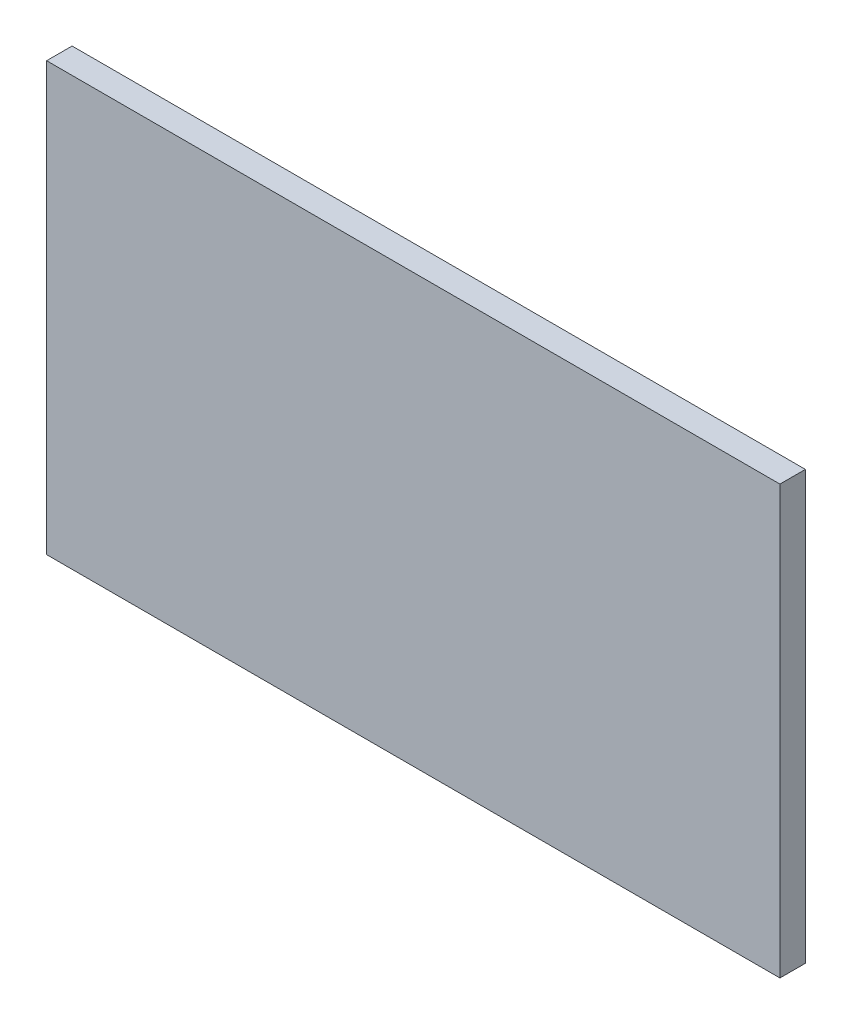
ISO-10303-21;
HEADER;
FILE_DESCRIPTION(('STEP AP214'),'2;1');
FILE_NAME('part.step','',(''),(''),'','','');
FILE_SCHEMA(('AUTOMOTIVE_DESIGN { 1 0 10303 214 1 1 1 1 }'));
ENDSEC;
DATA;
#1=APPLICATION_CONTEXT('core data for automotive mechanical design processes');
#2=APPLICATION_PROTOCOL_DEFINITION('international standard','automotive_design',2000,#1);
#3=PRODUCT_CONTEXT('',#1,'mechanical');
#4=PRODUCT('Part','Part','',(#3));
#5=PRODUCT_RELATED_PRODUCT_CATEGORY('part','',(#4));
#6=PRODUCT_DEFINITION_FORMATION('','',#4);
#7=PRODUCT_DEFINITION_CONTEXT('part definition',#1,'design');
#8=PRODUCT_DEFINITION('design','',#6,#7);
#9=PRODUCT_DEFINITION_SHAPE('','',#8);
#10=(LENGTH_UNIT() NAMED_UNIT(*) SI_UNIT(.MILLI.,.METRE.));
#11=(NAMED_UNIT(*) PLANE_ANGLE_UNIT() SI_UNIT($,.RADIAN.));
#12=(NAMED_UNIT(*) SI_UNIT($,.STERADIAN.) SOLID_ANGLE_UNIT());
#13=UNCERTAINTY_MEASURE_WITH_UNIT(LENGTH_MEASURE(1.E-05),#10,'distance_accuracy_value','');
#14=(GEOMETRIC_REPRESENTATION_CONTEXT(3) GLOBAL_UNCERTAINTY_ASSIGNED_CONTEXT((#13)) GLOBAL_UNIT_ASSIGNED_CONTEXT((#10,
#11,#12)) REPRESENTATION_CONTEXT('',''));
#15=CARTESIAN_POINT('',(0.,0.,0.));
#16=DIRECTION('',(0.,0.,1.));
#17=DIRECTION('',(1.,0.,0.));
#18=AXIS2_PLACEMENT_3D('',#15,#16,#17);
#19=CARTESIAN_POINT('',(0.,0.,50.));
#20=DIRECTION('',(1.,0.,0.));
#21=DIRECTION('',(0.,0.,-1.));
#22=AXIS2_PLACEMENT_3D('',#19,#20,#21);
#23=PLANE('',#22);
#24=DIRECTION('',(0.,-1.,0.));
#25=VECTOR('',#24,1.);
#26=CARTESIAN_POINT('',(0.,0.,0.));
#27=LINE('',#26,#25);
#28=CARTESIAN_POINT('',(0.,840.,0.));
#29=VERTEX_POINT('',#28);
#30=CARTESIAN_POINT('',(0.,0.,0.));
#31=VERTEX_POINT('',#30);
#32=EDGE_CURVE('E96',#29,#31,#27,.T.);
#33=ORIENTED_EDGE('',*,*,#32,.T.);
#34=DIRECTION('',(0.,0.,-1.));
#35=VECTOR('',#34,1.);
#36=CARTESIAN_POINT('',(0.,0.,50.));
#37=LINE('',#36,#35);
#38=CARTESIAN_POINT('',(0.,0.,50.));
#39=VERTEX_POINT('',#38);
#40=EDGE_CURVE('E11',#39,#31,#37,.T.);
#41=ORIENTED_EDGE('',*,*,#40,.F.);
#42=DIRECTION('',(0.,-1.,0.));
#43=VECTOR('',#42,1.);
#44=CARTESIAN_POINT('',(0.,0.,50.));
#45=LINE('',#44,#43);
#46=CARTESIAN_POINT('',(0.,840.,50.));
#47=VERTEX_POINT('',#46);
#48=EDGE_CURVE('E84',#47,#39,#45,.T.);
#49=ORIENTED_EDGE('',*,*,#48,.F.);
#50=DIRECTION('',(0.,0.,-1.));
#51=VECTOR('',#50,1.);
#52=CARTESIAN_POINT('',(0.,840.,50.));
#53=LINE('',#52,#51);
#54=EDGE_CURVE('E92',#47,#29,#53,.T.);
#55=ORIENTED_EDGE('',*,*,#54,.T.);
#56=EDGE_LOOP('',(#33,#41,#49,#55));
#57=FACE_BOUND('',#56,.T.);
#58=ADVANCED_FACE('F33',(#57),#23,.F.);
#59=CARTESIAN_POINT('',(0.,0.,50.));
#60=DIRECTION('',(0.,1.,0.));
#61=DIRECTION('',(0.,0.,1.));
#62=AXIS2_PLACEMENT_3D('',#59,#60,#61);
#63=PLANE('',#62);
#64=DIRECTION('',(1.,0.,0.));
#65=VECTOR('',#64,1.);
#66=CARTESIAN_POINT('',(0.,0.,0.));
#67=LINE('',#66,#65);
#68=CARTESIAN_POINT('',(1440.,0.,0.));
#69=VERTEX_POINT('',#68);
#70=EDGE_CURVE('E88',#31,#69,#67,.T.);
#71=ORIENTED_EDGE('',*,*,#70,.T.);
#72=DIRECTION('',(0.,0.,-1.));
#73=VECTOR('',#72,1.);
#74=CARTESIAN_POINT('',(1440.,0.,50.));
#75=LINE('',#74,#73);
#76=CARTESIAN_POINT('',(1440.,0.,50.));
#77=VERTEX_POINT('',#76);
#78=EDGE_CURVE('E41',#77,#69,#75,.T.);
#79=ORIENTED_EDGE('',*,*,#78,.F.);
#80=DIRECTION('',(1.,0.,0.));
#81=VECTOR('',#80,1.);
#82=CARTESIAN_POINT('',(0.,0.,50.));
#83=LINE('',#82,#81);
#84=EDGE_CURVE('E79',#39,#77,#83,.T.);
#85=ORIENTED_EDGE('',*,*,#84,.F.);
#86=ORIENTED_EDGE('',*,*,#40,.T.);
#87=EDGE_LOOP('',(#71,#79,#85,#86));
#88=FACE_BOUND('',#87,.T.);
#89=ADVANCED_FACE('F87',(#88),#63,.F.);
#90=CARTESIAN_POINT('',(1440.,0.,50.));
#91=DIRECTION('',(-1.,0.,0.));
#92=DIRECTION('',(0.,0.,1.));
#93=AXIS2_PLACEMENT_3D('',#90,#91,#92);
#94=PLANE('',#93);
#95=DIRECTION('',(0.,1.,0.));
#96=VECTOR('',#95,1.);
#97=CARTESIAN_POINT('',(1440.,0.,0.));
#98=LINE('',#97,#96);
#99=CARTESIAN_POINT('',(1440.,840.,0.));
#100=VERTEX_POINT('',#99);
#101=EDGE_CURVE('E66',#69,#100,#98,.T.);
#102=ORIENTED_EDGE('',*,*,#101,.T.);
#103=DIRECTION('',(0.,0.,-1.));
#104=VECTOR('',#103,1.);
#105=CARTESIAN_POINT('',(1440.,840.,50.));
#106=LINE('',#105,#104);
#107=CARTESIAN_POINT('',(1440.,840.,50.));
#108=VERTEX_POINT('',#107);
#109=EDGE_CURVE('E89',#108,#100,#106,.T.);
#110=ORIENTED_EDGE('',*,*,#109,.F.);
#111=DIRECTION('',(0.,1.,0.));
#112=VECTOR('',#111,1.);
#113=CARTESIAN_POINT('',(1440.,0.,50.));
#114=LINE('',#113,#112);
#115=EDGE_CURVE('E82',#77,#108,#114,.T.);
#116=ORIENTED_EDGE('',*,*,#115,.F.);
#117=ORIENTED_EDGE('',*,*,#78,.T.);
#118=EDGE_LOOP('',(#102,#110,#116,#117));
#119=FACE_BOUND('',#118,.T.);
#120=ADVANCED_FACE('F90',(#119),#94,.F.);
#121=CARTESIAN_POINT('',(0.,840.,50.));
#122=DIRECTION('',(0.,-1.,0.));
#123=DIRECTION('',(0.,0.,-1.));
#124=AXIS2_PLACEMENT_3D('',#121,#122,#123);
#125=PLANE('',#124);
#126=DIRECTION('',(-1.,0.,0.));
#127=VECTOR('',#126,1.);
#128=CARTESIAN_POINT('',(0.,840.,0.));
#129=LINE('',#128,#127);
#130=EDGE_CURVE('E72',#100,#29,#129,.T.);
#131=ORIENTED_EDGE('',*,*,#130,.T.);
#132=ORIENTED_EDGE('',*,*,#54,.F.);
#133=DIRECTION('',(-1.,0.,0.));
#134=VECTOR('',#133,1.);
#135=CARTESIAN_POINT('',(0.,840.,50.));
#136=LINE('',#135,#134);
#137=EDGE_CURVE('E49',#108,#47,#136,.T.);
#138=ORIENTED_EDGE('',*,*,#137,.F.);
#139=ORIENTED_EDGE('',*,*,#109,.T.);
#140=EDGE_LOOP('',(#131,#132,#138,#139));
#141=FACE_BOUND('',#140,.T.);
#142=ADVANCED_FACE('F103',(#141),#125,.F.);
#143=CARTESIAN_POINT('',(0.,0.,50.));
#144=DIRECTION('',(0.,0.,-1.));
#145=DIRECTION('',(-1.,0.,0.));
#146=AXIS2_PLACEMENT_3D('',#143,#144,#145);
#147=PLANE('',#146);
#148=ORIENTED_EDGE('',*,*,#48,.T.);
#149=ORIENTED_EDGE('',*,*,#84,.T.);
#150=ORIENTED_EDGE('',*,*,#115,.T.);
#151=ORIENTED_EDGE('',*,*,#137,.T.);
#152=EDGE_LOOP('',(#148,#149,#150,#151));
#153=FACE_BOUND('',#152,.T.);
#154=ADVANCED_FACE('F80',(#153),#147,.F.);
#155=CARTESIAN_POINT('',(0.,0.,0.));
#156=DIRECTION('',(0.,0.,-1.));
#157=DIRECTION('',(-1.,0.,0.));
#158=AXIS2_PLACEMENT_3D('',#155,#156,#157);
#159=PLANE('',#158);
#160=ORIENTED_EDGE('',*,*,#32,.F.);
#161=ORIENTED_EDGE('',*,*,#130,.F.);
#162=ORIENTED_EDGE('',*,*,#101,.F.);
#163=ORIENTED_EDGE('',*,*,#70,.F.);
#164=EDGE_LOOP('',(#160,#161,#162,#163));
#165=FACE_BOUND('',#164,.T.);
#166=ADVANCED_FACE('F106',(#165),#159,.T.);
#167=CLOSED_SHELL('',(#58,#89,#120,#142,#154,#166));
#168=MANIFOLD_SOLID_BREP('B2',#167);
#169=ADVANCED_BREP_SHAPE_REPRESENTATION('',(#18,#168),#14);
#170=SHAPE_DEFINITION_REPRESENTATION(#9,#169);
ENDSEC;
END-ISO-10303-21;
